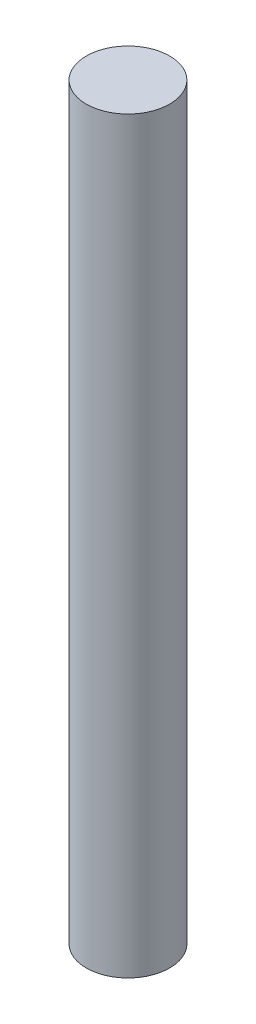
ISO-10303-21;
HEADER;
FILE_DESCRIPTION(('STEP AP214'),'2;1');
FILE_NAME('part.step','',(''),(''),'','','');
FILE_SCHEMA(('AUTOMOTIVE_DESIGN { 1 0 10303 214 1 1 1 1 }'));
ENDSEC;
DATA;
#1=APPLICATION_CONTEXT('core data for automotive mechanical design processes');
#2=APPLICATION_PROTOCOL_DEFINITION('international standard','automotive_design',2000,#1);
#3=PRODUCT_CONTEXT('',#1,'mechanical');
#4=PRODUCT('Part','Part','',(#3));
#5=PRODUCT_RELATED_PRODUCT_CATEGORY('part','',(#4));
#6=PRODUCT_DEFINITION_FORMATION('','',#4);
#7=PRODUCT_DEFINITION_CONTEXT('part definition',#1,'design');
#8=PRODUCT_DEFINITION('design','',#6,#7);
#9=PRODUCT_DEFINITION_SHAPE('','',#8);
#10=(LENGTH_UNIT() NAMED_UNIT(*) SI_UNIT(.MILLI.,.METRE.));
#11=(NAMED_UNIT(*) PLANE_ANGLE_UNIT() SI_UNIT($,.RADIAN.));
#12=(NAMED_UNIT(*) SI_UNIT($,.STERADIAN.) SOLID_ANGLE_UNIT());
#13=UNCERTAINTY_MEASURE_WITH_UNIT(LENGTH_MEASURE(1.E-05),#10,'distance_accuracy_value','');
#14=(GEOMETRIC_REPRESENTATION_CONTEXT(3) GLOBAL_UNCERTAINTY_ASSIGNED_CONTEXT((#13)) GLOBAL_UNIT_ASSIGNED_CONTEXT((#10,
#11,#12)) REPRESENTATION_CONTEXT('',''));
#15=CARTESIAN_POINT('',(0.,0.,0.));
#16=DIRECTION('',(0.,0.,1.));
#17=DIRECTION('',(1.,0.,0.));
#18=AXIS2_PLACEMENT_3D('',#15,#16,#17);
#19=CARTESIAN_POINT('',(0.,70.,0.));
#20=DIRECTION('',(0.,-1.,0.));
#21=DIRECTION('',(0.,0.,-1.));
#22=AXIS2_PLACEMENT_3D('',#19,#20,#21);
#23=CYLINDRICAL_SURFACE('',#22,3.9);
#24=CARTESIAN_POINT('',(0.,70.,0.));
#25=DIRECTION('',(0.,1.,0.));
#26=DIRECTION('',(0.,0.,1.));
#27=AXIS2_PLACEMENT_3D('',#24,#25,#26);
#28=CIRCLE('',#27,3.9);
#29=CARTESIAN_POINT('',(0.,70.,3.9));
#30=VERTEX_POINT('',#29);
#31=EDGE_CURVE('E10',#30,#30,#28,.T.);
#32=ORIENTED_EDGE('',*,*,#31,.F.);
#33=EDGE_LOOP('',(#32));
#34=FACE_BOUND('',#33,.T.);
#35=CARTESIAN_POINT('',(0.,0.,0.));
#36=DIRECTION('',(0.,1.,0.));
#37=DIRECTION('',(0.,0.,1.));
#38=AXIS2_PLACEMENT_3D('',#35,#36,#37);
#39=CIRCLE('',#38,3.9);
#40=CARTESIAN_POINT('',(0.,0.,3.9));
#41=VERTEX_POINT('',#40);
#42=EDGE_CURVE('E34',#41,#41,#39,.T.);
#43=ORIENTED_EDGE('',*,*,#42,.T.);
#44=EDGE_LOOP('',(#43));
#45=FACE_BOUND('',#44,.T.);
#46=ADVANCED_FACE('F31',(#34,#45),#23,.T.);
#47=CARTESIAN_POINT('',(0.,70.,0.));
#48=DIRECTION('',(0.,1.,0.));
#49=DIRECTION('',(0.,0.,1.));
#50=AXIS2_PLACEMENT_3D('',#47,#48,#49);
#51=PLANE('',#50);
#52=ORIENTED_EDGE('',*,*,#31,.T.);
#53=EDGE_LOOP('',(#52));
#54=FACE_BOUND('',#53,.T.);
#55=ADVANCED_FACE('F46',(#54),#51,.T.);
#56=CARTESIAN_POINT('',(0.,0.,0.));
#57=DIRECTION('',(0.,1.,0.));
#58=DIRECTION('',(0.,0.,1.));
#59=AXIS2_PLACEMENT_3D('',#56,#57,#58);
#60=PLANE('',#59);
#61=ORIENTED_EDGE('',*,*,#42,.F.);
#62=EDGE_LOOP('',(#61));
#63=FACE_BOUND('',#62,.T.);
#64=ADVANCED_FACE('F44',(#63),#60,.F.);
#65=CLOSED_SHELL('',(#46,#55,#64));
#66=MANIFOLD_SOLID_BREP('B2',#65);
#67=ADVANCED_BREP_SHAPE_REPRESENTATION('',(#18,#66),#14);
#68=SHAPE_DEFINITION_REPRESENTATION(#9,#67);
ENDSEC;
END-ISO-10303-21;
